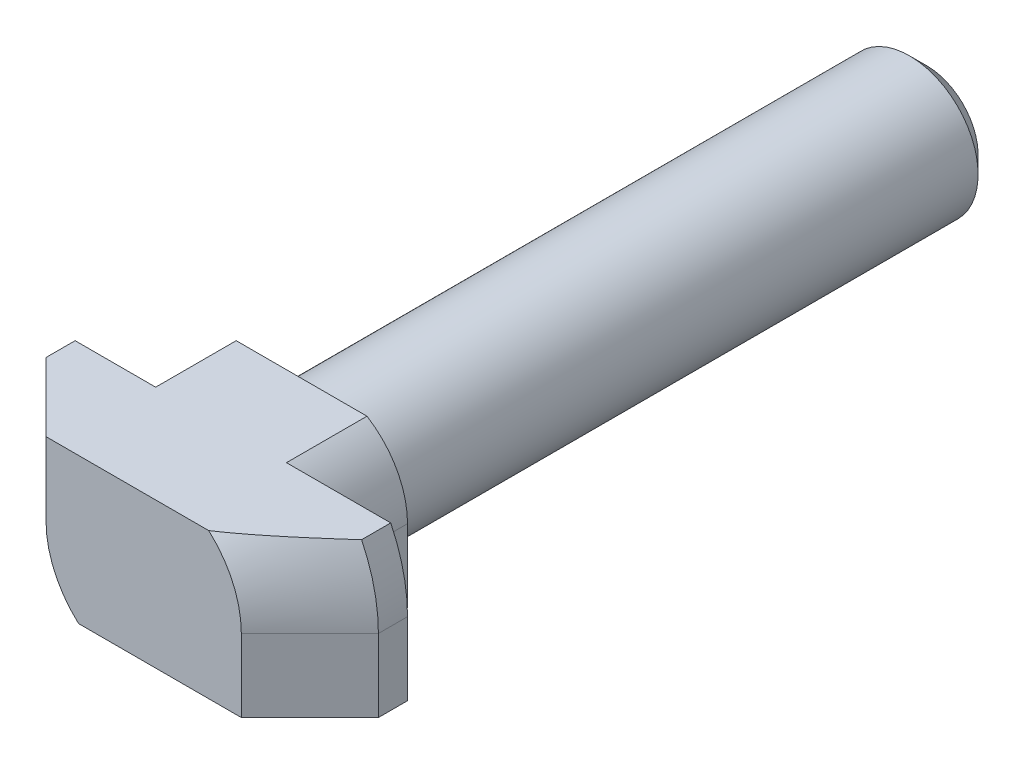
ISO-10303-21;
HEADER;
FILE_DESCRIPTION(('STEP AP214'),'2;1');
FILE_NAME('part.step','',(''),(''),'','','');
FILE_SCHEMA(('AUTOMOTIVE_DESIGN { 1 0 10303 214 1 1 1 1 }'));
ENDSEC;
DATA;
#1=APPLICATION_CONTEXT('core data for automotive mechanical design processes');
#2=APPLICATION_PROTOCOL_DEFINITION('international standard','automotive_design',2000,#1);
#3=PRODUCT_CONTEXT('',#1,'mechanical');
#4=PRODUCT('Part','Part','',(#3));
#5=PRODUCT_RELATED_PRODUCT_CATEGORY('part','',(#4));
#6=PRODUCT_DEFINITION_FORMATION('','',#4);
#7=PRODUCT_DEFINITION_CONTEXT('part definition',#1,'design');
#8=PRODUCT_DEFINITION('design','',#6,#7);
#9=PRODUCT_DEFINITION_SHAPE('','',#8);
#10=(LENGTH_UNIT() NAMED_UNIT(*) SI_UNIT(.MILLI.,.METRE.));
#11=(NAMED_UNIT(*) PLANE_ANGLE_UNIT() SI_UNIT($,.RADIAN.));
#12=(NAMED_UNIT(*) SI_UNIT($,.STERADIAN.) SOLID_ANGLE_UNIT());
#13=UNCERTAINTY_MEASURE_WITH_UNIT(LENGTH_MEASURE(1.E-05),#10,'distance_accuracy_value','');
#14=(GEOMETRIC_REPRESENTATION_CONTEXT(3) GLOBAL_UNCERTAINTY_ASSIGNED_CONTEXT((#13)) GLOBAL_UNIT_ASSIGNED_CONTEXT((#10,
#11,#12)) REPRESENTATION_CONTEXT('',''));
#15=CARTESIAN_POINT('',(0.,0.,0.));
#16=DIRECTION('',(0.,0.,1.));
#17=DIRECTION('',(1.,0.,0.));
#18=AXIS2_PLACEMENT_3D('',#15,#16,#17);
#19=CARTESIAN_POINT('',(-5.,-4.25,-3.5));
#20=DIRECTION('',(-1.,0.,0.));
#21=DIRECTION('',(0.,1.,0.));
#22=AXIS2_PLACEMENT_3D('',#19,#20,#21);
#23=PLANE('',#22);
#24=DIRECTION('',(0.,0.,1.));
#25=VECTOR('',#24,1.);
#26=CARTESIAN_POINT('',(-5.,4.25,-4.7));
#27=LINE('',#26,#25);
#28=CARTESIAN_POINT('',(-5.,4.25,-4.7));
#29=VERTEX_POINT('',#28);
#30=CARTESIAN_POINT('',(-5.,4.25,0.));
#31=VERTEX_POINT('',#30);
#32=EDGE_CURVE('E315',#29,#31,#27,.T.);
#33=ORIENTED_EDGE('',*,*,#32,.F.);
#34=DIRECTION('',(0.,1.,0.));
#35=VECTOR('',#34,1.);
#36=CARTESIAN_POINT('',(-5.,0.,-4.7));
#37=LINE('',#36,#35);
#38=CARTESIAN_POINT('',(-5.,0.,-4.7));
#39=VERTEX_POINT('',#38);
#40=EDGE_CURVE('E166',#39,#29,#37,.T.);
#41=ORIENTED_EDGE('',*,*,#40,.F.);
#42=DIRECTION('',(0.,0.,-1.));
#43=VECTOR('',#42,1.);
#44=CARTESIAN_POINT('',(-5.,0.,0.));
#45=LINE('',#44,#43);
#46=CARTESIAN_POINT('',(-5.,0.,0.));
#47=VERTEX_POINT('',#46);
#48=EDGE_CURVE('E99',#47,#39,#45,.T.);
#49=ORIENTED_EDGE('',*,*,#48,.F.);
#50=DIRECTION('',(0.,-1.,0.));
#51=VECTOR('',#50,1.);
#52=CARTESIAN_POINT('',(-5.,4.25,0.));
#53=LINE('',#52,#51);
#54=EDGE_CURVE('E183',#31,#47,#53,.T.);
#55=ORIENTED_EDGE('',*,*,#54,.F.);
#56=EDGE_LOOP('',(#33,#41,#49,#55));
#57=FACE_BOUND('',#56,.T.);
#58=ADVANCED_FACE('F16',(#57),#23,.T.);
#59=CARTESIAN_POINT('',(-9.7,-4.25,0.));
#60=DIRECTION('',(-1.,0.,0.));
#61=DIRECTION('',(0.,1.,0.));
#62=AXIS2_PLACEMENT_3D('',#59,#60,#61);
#63=PLANE('',#62);
#64=DIRECTION('',(0.,0.,1.));
#65=VECTOR('',#64,1.);
#66=CARTESIAN_POINT('',(-9.7,4.25,0.));
#67=LINE('',#66,#65);
#68=CARTESIAN_POINT('',(-9.7,4.25,0.));
#69=VERTEX_POINT('',#68);
#70=CARTESIAN_POINT('',(-9.7,4.25,1.7));
#71=VERTEX_POINT('',#70);
#72=EDGE_CURVE('E312',#69,#71,#67,.T.);
#73=ORIENTED_EDGE('',*,*,#72,.F.);
#74=DIRECTION('',(0.,1.,0.));
#75=VECTOR('',#74,1.);
#76=CARTESIAN_POINT('',(-9.7,0.,0.));
#77=LINE('',#76,#75);
#78=CARTESIAN_POINT('',(-9.7,-1.3280931909776E-13,0.));
#79=VERTEX_POINT('',#78);
#80=EDGE_CURVE('E184',#79,#69,#77,.T.);
#81=ORIENTED_EDGE('',*,*,#80,.F.);
#82=DIRECTION('',(0.,0.,-1.));
#83=VECTOR('',#82,1.);
#84=CARTESIAN_POINT('',(-9.7,0.,1.7));
#85=LINE('',#84,#83);
#86=CARTESIAN_POINT('',(-9.7,0.,1.7));
#87=VERTEX_POINT('',#86);
#88=EDGE_CURVE('E343',#87,#79,#85,.T.);
#89=ORIENTED_EDGE('',*,*,#88,.F.);
#90=DIRECTION('',(0.,-1.,0.));
#91=VECTOR('',#90,1.);
#92=CARTESIAN_POINT('',(-9.7,4.25,1.7));
#93=LINE('',#92,#91);
#94=EDGE_CURVE('E11',#71,#87,#93,.T.);
#95=ORIENTED_EDGE('',*,*,#94,.F.);
#96=EDGE_LOOP('',(#73,#81,#89,#95));
#97=FACE_BOUND('',#96,.T.);
#98=ADVANCED_FACE('F264',(#97),#63,.T.);
#99=CARTESIAN_POINT('',(-9.7,-4.25,1.7));
#100=DIRECTION('',(-0.707106781186547,0.,0.707106781186548));
#101=DIRECTION('',(0.,1.,0.));
#102=AXIS2_PLACEMENT_3D('',#99,#100,#101);
#103=PLANE('',#102);
#104=DIRECTION('',(0.707106781186548,0.,0.707106781186547));
#105=VECTOR('',#104,1.);
#106=CARTESIAN_POINT('',(-9.7,4.25,1.7));
#107=LINE('',#106,#105);
#108=CARTESIAN_POINT('',(-5.7,4.25,5.7));
#109=VERTEX_POINT('',#108);
#110=EDGE_CURVE('E314',#71,#109,#107,.T.);
#111=ORIENTED_EDGE('',*,*,#110,.F.);
#112=ORIENTED_EDGE('',*,*,#94,.T.);
#113=DIRECTION('',(-0.707106781186548,0.,-0.707106781186547));
#114=VECTOR('',#113,1.);
#115=CARTESIAN_POINT('',(-5.7,0.,5.7));
#116=LINE('',#115,#114);
#117=CARTESIAN_POINT('',(-5.7,-1.19015908239817E-13,5.7));
#118=VERTEX_POINT('',#117);
#119=EDGE_CURVE('E175',#118,#87,#116,.T.);
#120=ORIENTED_EDGE('',*,*,#119,.F.);
#121=DIRECTION('',(0.,-1.,0.));
#122=VECTOR('',#121,1.);
#123=CARTESIAN_POINT('',(-5.7,4.25,5.7));
#124=LINE('',#123,#122);
#125=EDGE_CURVE('E390',#109,#118,#124,.T.);
#126=ORIENTED_EDGE('',*,*,#125,.F.);
#127=EDGE_LOOP('',(#111,#112,#120,#126));
#128=FACE_BOUND('',#127,.T.);
#129=ADVANCED_FACE('F263',(#128),#103,.T.);
#130=CARTESIAN_POINT('',(0.,-4.25,0.));
#131=DIRECTION('',(0.,1.,0.));
#132=DIRECTION('',(1.,0.,0.));
#133=AXIS2_PLACEMENT_3D('',#130,#131,#132);
#134=PLANE('',#133);
#135=DIRECTION('',(1.,0.,0.));
#136=VECTOR('',#135,1.);
#137=CARTESIAN_POINT('',(-8.71937497760017,-4.25,0.));
#138=LINE('',#137,#136);
#139=CARTESIAN_POINT('',(-8.71937497760017,-4.25,0.));
#140=VERTEX_POINT('',#139);
#141=CARTESIAN_POINT('',(-2.63391343821319,-4.25,0.));
#142=VERTEX_POINT('',#141);
#143=EDGE_CURVE('E348',#140,#142,#138,.T.);
#144=ORIENTED_EDGE('',*,*,#143,.T.);
#145=DIRECTION('',(0.,0.,1.));
#146=VECTOR('',#145,1.);
#147=CARTESIAN_POINT('',(-2.63391343821319,-4.25,-4.7));
#148=LINE('',#147,#146);
#149=CARTESIAN_POINT('',(-2.63391343821319,-4.25,-4.7));
#150=VERTEX_POINT('',#149);
#151=EDGE_CURVE('E168',#150,#142,#148,.T.);
#152=ORIENTED_EDGE('',*,*,#151,.F.);
#153=DIRECTION('',(-1.,0.,0.));
#154=VECTOR('',#153,1.);
#155=CARTESIAN_POINT('',(5.,-4.25,-4.7));
#156=LINE('',#155,#154);
#157=CARTESIAN_POINT('',(5.,-4.25,-4.7));
#158=VERTEX_POINT('',#157);
#159=EDGE_CURVE('E323',#158,#150,#156,.T.);
#160=ORIENTED_EDGE('',*,*,#159,.F.);
#161=DIRECTION('',(0.,0.,1.));
#162=VECTOR('',#161,1.);
#163=CARTESIAN_POINT('',(5.,-4.25,-4.7));
#164=LINE('',#163,#162);
#165=CARTESIAN_POINT('',(5.,-4.25,0.));
#166=VERTEX_POINT('',#165);
#167=EDGE_CURVE('E162',#158,#166,#164,.T.);
#168=ORIENTED_EDGE('',*,*,#167,.T.);
#169=DIRECTION('',(1.,0.,0.));
#170=VECTOR('',#169,1.);
#171=CARTESIAN_POINT('',(5.,-4.25,0.));
#172=LINE('',#171,#170);
#173=CARTESIAN_POINT('',(9.7,-4.25,0.));
#174=VERTEX_POINT('',#173);
#175=EDGE_CURVE('E156',#166,#174,#172,.T.);
#176=ORIENTED_EDGE('',*,*,#175,.T.);
#177=DIRECTION('',(0.,0.,1.));
#178=VECTOR('',#177,1.);
#179=CARTESIAN_POINT('',(9.7,-4.25,0.));
#180=LINE('',#179,#178);
#181=CARTESIAN_POINT('',(9.7,-4.25,1.7));
#182=VERTEX_POINT('',#181);
#183=EDGE_CURVE('E27',#174,#182,#180,.T.);
#184=ORIENTED_EDGE('',*,*,#183,.T.);
#185=DIRECTION('',(-0.707106781186547,0.,0.707106781186548));
#186=VECTOR('',#185,1.);
#187=CARTESIAN_POINT('',(9.7,-4.25,1.7));
#188=LINE('',#187,#186);
#189=CARTESIAN_POINT('',(5.7,-4.25,5.7));
#190=VERTEX_POINT('',#189);
#191=EDGE_CURVE('E335',#182,#190,#188,.T.);
#192=ORIENTED_EDGE('',*,*,#191,.T.);
#193=DIRECTION('',(-1.,0.,0.));
#194=VECTOR('',#193,1.);
#195=CARTESIAN_POINT('',(5.7,-4.25,5.7));
#196=LINE('',#195,#194);
#197=CARTESIAN_POINT('',(-3.79835490706175,-4.25,5.7));
#198=VERTEX_POINT('',#197);
#199=EDGE_CURVE('E368',#190,#198,#196,.T.);
#200=ORIENTED_EDGE('',*,*,#199,.T.);
#201=CARTESIAN_POINT('',(-8.71937497760019,-4.24999999999997,1.70000000000001));
#202=CARTESIAN_POINT('',(-8.57450270494282,-4.25000319465092,1.83021943252909));
#203=CARTESIAN_POINT('',(-8.42931728141366,-4.25004385302308,1.96009161295506));
#204=CARTESIAN_POINT('',(-8.1437825474531,-4.25014152903638,2.21409873690859));
#205=CARTESIAN_POINT('',(-8.00345988492291,-4.25019786389707,2.33826364440192));
#206=CARTESIAN_POINT('',(-7.72764747755327,-4.25027542681914,2.58085892885828));
#207=CARTESIAN_POINT('',(-7.59218629004772,-4.2502979562429,2.69932175295181));
#208=CARTESIAN_POINT('',(-7.32608002049505,-4.25029385836591,2.93050866643692));
#209=CARTESIAN_POINT('',(-7.19546594552676,-4.25026921429713,3.04326842909159));
#210=CARTESIAN_POINT('',(-6.93902863210305,-4.25018370852051,3.26304706374375));
#211=CARTESIAN_POINT('',(-6.81323919190168,-4.25012443956091,3.37010534376589));
#212=CARTESIAN_POINT('',(-6.5664104194106,-4.25002340655793,3.57847427538683));
#213=CARTESIAN_POINT('',(-6.4454083031052,-4.24998098186133,3.67982898664687));
#214=CARTESIAN_POINT('',(-6.18165550366021,-4.24995904779762,3.89875238754623));
#215=CARTESIAN_POINT('',(-6.03873633980194,-4.24999158583165,4.01611840018248));
#216=CARTESIAN_POINT('',(-5.75820107982702,-4.25003674648944,4.24365468483897));
#217=CARTESIAN_POINT('',(-5.62064973052614,-4.25005022968583,4.3539047032508));
#218=CARTESIAN_POINT('',(-5.35078258937413,-4.25002434400976,4.56720562462831));
#219=CARTESIAN_POINT('',(-5.21853751991184,-4.24998751367225,4.67034587747562));
#220=CARTESIAN_POINT('',(-4.93792226345441,-4.24995810734381,4.88568698798326));
#221=CARTESIAN_POINT('',(-4.78936759257905,-4.24997080067208,4.99764798234654));
#222=CARTESIAN_POINT('',(-4.49781207699236,-4.24999785078291,5.21262804183896));
#223=CARTESIAN_POINT('',(-4.3549301124361,-4.25001208494948,5.31580768428956));
#224=CARTESIAN_POINT('',(-4.07448766867418,-4.25002240543764,5.51315957745188));
#225=CARTESIAN_POINT('',(-3.93705740064285,-4.25001943175796,5.60751715888763));
#226=CARTESIAN_POINT('',(-3.79835490706176,-4.24999999999998,5.70000000000001));
#227=B_SPLINE_CURVE_WITH_KNOTS('',3,(#201,#202,#203,#204,#205,#206,#207,#208,#209,#210,#211,
#212,#213,#214,#215,#216,#217,#218,#219,#220,#221,#222,#223,#224,#225,#226),.UNSPECIFIED.,.F.,
.F.,(4,2,2,2,2,2,2,2,2,2,2,2,4),(0.,0.584385416812869,1.14649156786177,1.68634794115197,
2.20400540412395,2.69954103939917,3.17306374359512,3.7278543681573,4.25668744993707,
4.75980107100538,5.31783118760138,5.84650912556475,6.3465900112296),.UNSPECIFIED.);
#228=CARTESIAN_POINT('',(-8.71937497760018,-4.25,1.7));
#229=VERTEX_POINT('',#228);
#230=EDGE_CURVE('E178',#229,#198,#227,.T.);
#231=ORIENTED_EDGE('',*,*,#230,.F.);
#232=DIRECTION('',(0.,0.,1.));
#233=VECTOR('',#232,1.);
#234=CARTESIAN_POINT('',(-8.71937497760017,-4.25,0.));
#235=LINE('',#234,#233);
#236=EDGE_CURVE('E345',#140,#229,#235,.T.);
#237=ORIENTED_EDGE('',*,*,#236,.F.);
#238=EDGE_LOOP('',(#144,#152,#160,#168,#176,#184,#192,#200,#231,#237));
#239=FACE_BOUND('',#238,.T.);
#240=ADVANCED_FACE('F254',(#239),#134,.F.);
#241=CARTESIAN_POINT('',(9.7,-4.25,1.7));
#242=DIRECTION('',(1.,0.,0.));
#243=DIRECTION('',(0.,-1.,0.));
#244=AXIS2_PLACEMENT_3D('',#241,#242,#243);
#245=PLANE('',#244);
#246=ORIENTED_EDGE('',*,*,#183,.F.);
#247=DIRECTION('',(0.,-1.,0.));
#248=VECTOR('',#247,1.);
#249=CARTESIAN_POINT('',(9.7,0.,0.));
#250=LINE('',#249,#248);
#251=CARTESIAN_POINT('',(9.7,1.4741097231763E-13,0.));
#252=VERTEX_POINT('',#251);
#253=EDGE_CURVE('E152',#252,#174,#250,.T.);
#254=ORIENTED_EDGE('',*,*,#253,.F.);
#255=DIRECTION('',(0.,0.,-1.));
#256=VECTOR('',#255,1.);
#257=CARTESIAN_POINT('',(9.7,0.,1.7));
#258=LINE('',#257,#256);
#259=CARTESIAN_POINT('',(9.7,0.,1.7));
#260=VERTEX_POINT('',#259);
#261=EDGE_CURVE('E144',#260,#252,#258,.T.);
#262=ORIENTED_EDGE('',*,*,#261,.F.);
#263=DIRECTION('',(0.,-1.,0.));
#264=VECTOR('',#263,1.);
#265=CARTESIAN_POINT('',(9.7,0.,1.7));
#266=LINE('',#265,#264);
#267=EDGE_CURVE('E186',#260,#182,#266,.T.);
#268=ORIENTED_EDGE('',*,*,#267,.T.);
#269=EDGE_LOOP('',(#246,#254,#262,#268));
#270=FACE_BOUND('',#269,.T.);
#271=ADVANCED_FACE('F158',(#270),#245,.T.);
#272=CARTESIAN_POINT('',(5.7,-4.25,5.7));
#273=DIRECTION('',(0.707106781186547,0.,0.707106781186548));
#274=DIRECTION('',(0.,-1.,0.));
#275=AXIS2_PLACEMENT_3D('',#272,#273,#274);
#276=PLANE('',#275);
#277=ORIENTED_EDGE('',*,*,#191,.F.);
#278=ORIENTED_EDGE('',*,*,#267,.F.);
#279=DIRECTION('',(0.707106781186548,0.,-0.707106781186548));
#280=VECTOR('',#279,1.);
#281=CARTESIAN_POINT('',(5.7,0.,5.7));
#282=LINE('',#281,#280);
#283=CARTESIAN_POINT('',(5.7,0.,5.7));
#284=VERTEX_POINT('',#283);
#285=EDGE_CURVE('E333',#284,#260,#282,.T.);
#286=ORIENTED_EDGE('',*,*,#285,.F.);
#287=DIRECTION('',(0.,-1.,0.));
#288=VECTOR('',#287,1.);
#289=CARTESIAN_POINT('',(5.7,0.,5.7));
#290=LINE('',#289,#288);
#291=EDGE_CURVE('E365',#284,#190,#290,.T.);
#292=ORIENTED_EDGE('',*,*,#291,.T.);
#293=EDGE_LOOP('',(#277,#278,#286,#292));
#294=FACE_BOUND('',#293,.T.);
#295=ADVANCED_FACE('F208',(#294),#276,.T.);
#296=CARTESIAN_POINT('',(0.,0.,1.61514379200931));
#297=DIRECTION('',(0.,0.,-1.));
#298=DIRECTION('',(-1.,0.,0.));
#299=AXIS2_PLACEMENT_3D('',#296,#297,#298);
#300=CONICAL_SURFACE('',#299,9.78485620799071,0.785398163397449);
#301=ORIENTED_EDGE('',*,*,#285,.T.);
#302=CARTESIAN_POINT('',(0.,0.,1.7));
#303=DIRECTION('',(0.,0.,1.));
#304=DIRECTION('',(1.,0.,0.));
#305=AXIS2_PLACEMENT_3D('',#302,#303,#304);
#306=CIRCLE('',#305,9.7);
#307=CARTESIAN_POINT('',(8.71937497760018,4.25,1.7));
#308=VERTEX_POINT('',#307);
#309=EDGE_CURVE('E146',#260,#308,#306,.T.);
#310=ORIENTED_EDGE('',*,*,#309,.T.);
#311=CARTESIAN_POINT('',(8.71937497760018,4.25,1.70000000000001));
#312=CARTESIAN_POINT('',(8.57450270590519,4.25000319464969,1.8302194316653));
#313=CARTESIAN_POINT('',(8.42931728333833,4.25004385303689,1.96009161122724));
#314=CARTESIAN_POINT('',(8.14378255091275,4.25014152907125,2.21409873382326));
#315=CARTESIAN_POINT('',(8.00345988895308,4.25019786393834,2.33826364082069));
#316=CARTESIAN_POINT('',(7.7276474823439,4.2502754268288,2.58085892465498));
#317=CARTESIAN_POINT('',(7.59218629502572,4.25029795621623,2.69932174861942));
#318=CARTESIAN_POINT('',(7.32608002548065,4.25029385817896,2.93050866221821));
#319=CARTESIAN_POINT('',(7.19546595032938,4.25026921398976,3.04326842511196));
#320=CARTESIAN_POINT('',(6.93902863618314,4.25018370785951,3.26304706061028));
#321=CARTESIAN_POINT('',(6.81323919543849,4.25012443867162,3.37010534123512));
#322=CARTESIAN_POINT('',(6.56641042153457,4.25002340501019,3.57847427444632));
#323=CARTESIAN_POINT('',(6.44540830435448,4.24998097989287,3.67982898668777));
#324=CARTESIAN_POINT('',(6.18165550296406,4.24995904481563,3.89875238981102));
#325=CARTESIAN_POINT('',(6.0387363380387,4.24999158223973,4.01611840369485));
#326=CARTESIAN_POINT('',(5.75820107712938,4.25003674195346,4.24365468969755));
#327=CARTESIAN_POINT('',(5.62064972797649,4.25005022480429,4.35390470822659));
#328=CARTESIAN_POINT('',(5.35078258824899,4.25002433888383,4.56720562868675));
#329=CARTESIAN_POINT('',(5.21853752008206,4.24998750862705,4.67034588052317));
#330=CARTESIAN_POINT('',(4.93792226671938,4.24995810300803,4.8856869883217));
#331=CARTESIAN_POINT('',(4.78936759763459,4.24997079702366,4.99764798097488));
#332=CARTESIAN_POINT('',(4.49781208363821,4.24999784856009,5.21262803854228));
#333=CARTESIAN_POINT('',(4.35493011885312,4.25001208346037,5.31580768074017));
#334=CARTESIAN_POINT('',(4.07448767280019,4.25002240503515,5.51315957491955));
#335=CARTESIAN_POINT('',(3.93705740266949,4.25001943172661,5.60751715757258));
#336=CARTESIAN_POINT('',(3.79835490706175,4.25,5.70000000000001));
#337=B_SPLINE_CURVE_WITH_KNOTS('',3,(#311,#312,#313,#314,#315,#316,#317,#318,#319,#320,#321,
#322,#323,#324,#325,#326,#327,#328,#329,#330,#331,#332,#333,#334,#335,#336),.UNSPECIFIED.,.F.,
.F.,(4,2,2,2,2,2,2,2,2,2,2,2,4),(0.,0.584385412933182,1.14649156171448,1.68634793432677,
2.20400539818323,2.69954103587226,3.17306374397149,3.72785437338236,4.25668745503392,
4.75980107116974,5.31783118038389,5.84650911846317,6.34659001138537),.UNSPECIFIED.);
#338=CARTESIAN_POINT('',(3.79835490706175,4.25,5.7));
#339=VERTEX_POINT('',#338);
#340=EDGE_CURVE('E191',#308,#339,#337,.T.);
#341=ORIENTED_EDGE('',*,*,#340,.T.);
#342=CARTESIAN_POINT('',(0.,0.,5.7));
#343=DIRECTION('',(0.,0.,1.));
#344=DIRECTION('',(1.,0.,0.));
#345=AXIS2_PLACEMENT_3D('',#342,#343,#344);
#346=CIRCLE('',#345,5.7);
#347=EDGE_CURVE('E367',#284,#339,#346,.T.);
#348=ORIENTED_EDGE('',*,*,#347,.F.);
#349=EDGE_LOOP('',(#301,#310,#341,#348));
#350=FACE_BOUND('',#349,.T.);
#351=ADVANCED_FACE('F198',(#350),#300,.T.);
#352=CARTESIAN_POINT('',(0.,0.,-3.96));
#353=DIRECTION('',(0.,0.,-1.));
#354=DIRECTION('',(-1.,0.,0.));
#355=AXIS2_PLACEMENT_3D('',#352,#353,#354);
#356=CYLINDRICAL_SURFACE('',#355,9.7);
#357=ORIENTED_EDGE('',*,*,#261,.T.);
#358=CARTESIAN_POINT('',(0.,0.,0.));
#359=DIRECTION('',(0.,0.,-1.));
#360=DIRECTION('',(0.898904636865997,0.438144329896907,0.));
#361=AXIS2_PLACEMENT_3D('',#358,#359,#360);
#362=CIRCLE('',#361,9.7);
#363=CARTESIAN_POINT('',(8.71937497760018,4.25,0.));
#364=VERTEX_POINT('',#363);
#365=EDGE_CURVE('E62',#364,#252,#362,.T.);
#366=ORIENTED_EDGE('',*,*,#365,.F.);
#367=DIRECTION('',(0.,0.,1.));
#368=VECTOR('',#367,1.);
#369=CARTESIAN_POINT('',(8.71937497760018,4.25,0.));
#370=LINE('',#369,#368);
#371=EDGE_CURVE('E332',#364,#308,#370,.T.);
#372=ORIENTED_EDGE('',*,*,#371,.T.);
#373=ORIENTED_EDGE('',*,*,#309,.F.);
#374=EDGE_LOOP('',(#357,#366,#372,#373));
#375=FACE_BOUND('',#374,.T.);
#376=ADVANCED_FACE('F145',(#375),#356,.T.);
#377=CARTESIAN_POINT('',(9.7,-4.25,0.));
#378=DIRECTION('',(0.,0.,-1.));
#379=DIRECTION('',(0.,1.,0.));
#380=AXIS2_PLACEMENT_3D('',#377,#378,#379);
#381=PLANE('',#380);
#382=ORIENTED_EDGE('',*,*,#253,.T.);
#383=ORIENTED_EDGE('',*,*,#175,.F.);
#384=DIRECTION('',(0.,1.,0.));
#385=VECTOR('',#384,1.);
#386=CARTESIAN_POINT('',(5.,-4.25,0.));
#387=LINE('',#386,#385);
#388=CARTESIAN_POINT('',(5.,0.,0.));
#389=VERTEX_POINT('',#388);
#390=EDGE_CURVE('E159',#166,#389,#387,.T.);
#391=ORIENTED_EDGE('',*,*,#390,.T.);
#392=CARTESIAN_POINT('',(0.,0.,0.));
#393=DIRECTION('',(0.,0.,1.));
#394=DIRECTION('',(1.,0.,0.));
#395=AXIS2_PLACEMENT_3D('',#392,#393,#394);
#396=CIRCLE('',#395,5.);
#397=CARTESIAN_POINT('',(2.63391343821319,4.25,0.));
#398=VERTEX_POINT('',#397);
#399=EDGE_CURVE('E51',#389,#398,#396,.T.);
#400=ORIENTED_EDGE('',*,*,#399,.T.);
#401=DIRECTION('',(-1.,0.,0.));
#402=VECTOR('',#401,1.);
#403=CARTESIAN_POINT('',(8.71937497760018,4.25,0.));
#404=LINE('',#403,#402);
#405=EDGE_CURVE('E154',#364,#398,#404,.T.);
#406=ORIENTED_EDGE('',*,*,#405,.F.);
#407=ORIENTED_EDGE('',*,*,#365,.T.);
#408=EDGE_LOOP('',(#382,#383,#391,#400,#406,#407));
#409=FACE_BOUND('',#408,.T.);
#410=ADVANCED_FACE('F151',(#409),#381,.T.);
#411=CARTESIAN_POINT('',(5.,-4.25,0.));
#412=DIRECTION('',(1.,0.,0.));
#413=DIRECTION('',(0.,-1.,0.));
#414=AXIS2_PLACEMENT_3D('',#411,#412,#413);
#415=PLANE('',#414);
#416=ORIENTED_EDGE('',*,*,#167,.F.);
#417=DIRECTION('',(0.,-1.,0.));
#418=VECTOR('',#417,1.);
#419=CARTESIAN_POINT('',(5.,0.,-4.7));
#420=LINE('',#419,#418);
#421=CARTESIAN_POINT('',(5.,0.,-4.7));
#422=VERTEX_POINT('',#421);
#423=EDGE_CURVE('E320',#422,#158,#420,.T.);
#424=ORIENTED_EDGE('',*,*,#423,.F.);
#425=DIRECTION('',(0.,0.,-1.));
#426=VECTOR('',#425,1.);
#427=CARTESIAN_POINT('',(5.,0.,0.));
#428=LINE('',#427,#426);
#429=EDGE_CURVE('E174',#389,#422,#428,.T.);
#430=ORIENTED_EDGE('',*,*,#429,.F.);
#431=ORIENTED_EDGE('',*,*,#390,.F.);
#432=EDGE_LOOP('',(#416,#424,#430,#431));
#433=FACE_BOUND('',#432,.T.);
#434=ADVANCED_FACE('F225',(#433),#415,.T.);
#435=CARTESIAN_POINT('',(0.,0.,-3.96));
#436=DIRECTION('',(0.,0.,-1.));
#437=DIRECTION('',(-1.,0.,0.));
#438=AXIS2_PLACEMENT_3D('',#435,#436,#437);
#439=CYLINDRICAL_SURFACE('',#438,5.);
#440=ORIENTED_EDGE('',*,*,#399,.F.);
#441=ORIENTED_EDGE('',*,*,#429,.T.);
#442=CARTESIAN_POINT('',(0.,0.,-4.7));
#443=DIRECTION('',(0.,0.,-1.));
#444=DIRECTION('',(0.526782687642637,0.85,0.));
#445=AXIS2_PLACEMENT_3D('',#442,#443,#444);
#446=CIRCLE('',#445,5.);
#447=CARTESIAN_POINT('',(2.63391343821319,4.25,-4.7));
#448=VERTEX_POINT('',#447);
#449=EDGE_CURVE('E324',#448,#422,#446,.T.);
#450=ORIENTED_EDGE('',*,*,#449,.F.);
#451=DIRECTION('',(0.,0.,1.));
#452=VECTOR('',#451,1.);
#453=CARTESIAN_POINT('',(2.63391343821319,4.25,-4.7));
#454=LINE('',#453,#452);
#455=EDGE_CURVE('E331',#448,#398,#454,.T.);
#456=ORIENTED_EDGE('',*,*,#455,.T.);
#457=EDGE_LOOP('',(#440,#441,#450,#456));
#458=FACE_BOUND('',#457,.T.);
#459=ADVANCED_FACE('F222',(#458),#439,.T.);
#460=CARTESIAN_POINT('',(0.,4.25,0.));
#461=DIRECTION('',(0.,1.,0.));
#462=DIRECTION('',(1.,0.,0.));
#463=AXIS2_PLACEMENT_3D('',#460,#461,#462);
#464=PLANE('',#463);
#465=DIRECTION('',(1.,0.,0.));
#466=VECTOR('',#465,1.);
#467=CARTESIAN_POINT('',(-5.,4.25,-4.7));
#468=LINE('',#467,#466);
#469=EDGE_CURVE('E337',#29,#448,#468,.T.);
#470=ORIENTED_EDGE('',*,*,#469,.F.);
#471=ORIENTED_EDGE('',*,*,#32,.T.);
#472=DIRECTION('',(1.,0.,0.));
#473=VECTOR('',#472,1.);
#474=CARTESIAN_POINT('',(-9.7,4.25,0.));
#475=LINE('',#474,#473);
#476=EDGE_CURVE('E180',#69,#31,#475,.T.);
#477=ORIENTED_EDGE('',*,*,#476,.F.);
#478=ORIENTED_EDGE('',*,*,#72,.T.);
#479=ORIENTED_EDGE('',*,*,#110,.T.);
#480=DIRECTION('',(1.,0.,0.));
#481=VECTOR('',#480,1.);
#482=CARTESIAN_POINT('',(-5.7,4.25,5.7));
#483=LINE('',#482,#481);
#484=EDGE_CURVE('E328',#109,#339,#483,.T.);
#485=ORIENTED_EDGE('',*,*,#484,.T.);
#486=ORIENTED_EDGE('',*,*,#340,.F.);
#487=ORIENTED_EDGE('',*,*,#371,.F.);
#488=ORIENTED_EDGE('',*,*,#405,.T.);
#489=ORIENTED_EDGE('',*,*,#455,.F.);
#490=EDGE_LOOP('',(#470,#471,#477,#478,#479,#485,#486,#487,#488,#489));
#491=FACE_BOUND('',#490,.T.);
#492=ADVANCED_FACE('F18',(#491),#464,.T.);
#493=CARTESIAN_POINT('',(-5.7,-4.25,5.7));
#494=DIRECTION('',(0.,0.,1.));
#495=DIRECTION('',(0.,-1.,0.));
#496=AXIS2_PLACEMENT_3D('',#493,#494,#495);
#497=PLANE('',#496);
#498=ORIENTED_EDGE('',*,*,#125,.T.);
#499=CARTESIAN_POINT('',(0.,0.,5.7));
#500=DIRECTION('',(0.,0.,1.));
#501=DIRECTION('',(-1.,0.,0.));
#502=AXIS2_PLACEMENT_3D('',#499,#500,#501);
#503=CIRCLE('',#502,5.7);
#504=EDGE_CURVE('E393',#118,#198,#503,.T.);
#505=ORIENTED_EDGE('',*,*,#504,.T.);
#506=ORIENTED_EDGE('',*,*,#199,.F.);
#507=ORIENTED_EDGE('',*,*,#291,.F.);
#508=ORIENTED_EDGE('',*,*,#347,.T.);
#509=ORIENTED_EDGE('',*,*,#484,.F.);
#510=EDGE_LOOP('',(#498,#505,#506,#507,#508,#509));
#511=FACE_BOUND('',#510,.T.);
#512=ADVANCED_FACE('F233',(#511),#497,.T.);
#513=CARTESIAN_POINT('',(0.,0.,1.6151437920093));
#514=DIRECTION('',(0.,0.,-1.));
#515=DIRECTION('',(-1.,0.,0.));
#516=AXIS2_PLACEMENT_3D('',#513,#514,#515);
#517=CONICAL_SURFACE('',#516,9.78485620799071,0.785398163397449);
#518=ORIENTED_EDGE('',*,*,#119,.T.);
#519=CARTESIAN_POINT('',(0.,0.,1.7));
#520=DIRECTION('',(0.,0.,1.));
#521=DIRECTION('',(-1.,0.,0.));
#522=AXIS2_PLACEMENT_3D('',#519,#520,#521);
#523=CIRCLE('',#522,9.7);
#524=EDGE_CURVE('E179',#87,#229,#523,.T.);
#525=ORIENTED_EDGE('',*,*,#524,.T.);
#526=ORIENTED_EDGE('',*,*,#230,.T.);
#527=ORIENTED_EDGE('',*,*,#504,.F.);
#528=EDGE_LOOP('',(#518,#525,#526,#527));
#529=FACE_BOUND('',#528,.T.);
#530=ADVANCED_FACE('F220',(#529),#517,.T.);
#531=CARTESIAN_POINT('',(0.,0.,-3.96));
#532=DIRECTION('',(0.,0.,-1.));
#533=DIRECTION('',(-1.,0.,0.));
#534=AXIS2_PLACEMENT_3D('',#531,#532,#533);
#535=CYLINDRICAL_SURFACE('',#534,9.7);
#536=ORIENTED_EDGE('',*,*,#88,.T.);
#537=CARTESIAN_POINT('',(0.,0.,0.));
#538=DIRECTION('',(0.,0.,-1.));
#539=DIRECTION('',(-0.898904636865997,-0.438144329896907,0.));
#540=AXIS2_PLACEMENT_3D('',#537,#538,#539);
#541=CIRCLE('',#540,9.7);
#542=EDGE_CURVE('E304',#140,#79,#541,.T.);
#543=ORIENTED_EDGE('',*,*,#542,.F.);
#544=ORIENTED_EDGE('',*,*,#236,.T.);
#545=ORIENTED_EDGE('',*,*,#524,.F.);
#546=EDGE_LOOP('',(#536,#543,#544,#545));
#547=FACE_BOUND('',#546,.T.);
#548=ADVANCED_FACE('F216',(#547),#535,.T.);
#549=CARTESIAN_POINT('',(-5.,-4.25,0.));
#550=DIRECTION('',(0.,0.,-1.));
#551=DIRECTION('',(0.,1.,0.));
#552=AXIS2_PLACEMENT_3D('',#549,#550,#551);
#553=PLANE('',#552);
#554=ORIENTED_EDGE('',*,*,#80,.T.);
#555=ORIENTED_EDGE('',*,*,#476,.T.);
#556=ORIENTED_EDGE('',*,*,#54,.T.);
#557=CARTESIAN_POINT('',(0.,0.,0.));
#558=DIRECTION('',(0.,0.,1.));
#559=DIRECTION('',(-1.,0.,0.));
#560=AXIS2_PLACEMENT_3D('',#557,#558,#559);
#561=CIRCLE('',#560,5.);
#562=EDGE_CURVE('E171',#47,#142,#561,.T.);
#563=ORIENTED_EDGE('',*,*,#562,.T.);
#564=ORIENTED_EDGE('',*,*,#143,.F.);
#565=ORIENTED_EDGE('',*,*,#542,.T.);
#566=EDGE_LOOP('',(#554,#555,#556,#563,#564,#565));
#567=FACE_BOUND('',#566,.T.);
#568=ADVANCED_FACE('F219',(#567),#553,.T.);
#569=CARTESIAN_POINT('',(0.,0.,-3.96));
#570=DIRECTION('',(0.,0.,-1.));
#571=DIRECTION('',(-1.,0.,0.));
#572=AXIS2_PLACEMENT_3D('',#569,#570,#571);
#573=CYLINDRICAL_SURFACE('',#572,5.);
#574=ORIENTED_EDGE('',*,*,#48,.T.);
#575=CARTESIAN_POINT('',(0.,0.,-4.7));
#576=DIRECTION('',(0.,0.,-1.));
#577=DIRECTION('',(-0.526782687642638,-0.85,0.));
#578=AXIS2_PLACEMENT_3D('',#575,#576,#577);
#579=CIRCLE('',#578,5.);
#580=EDGE_CURVE('E317',#150,#39,#579,.T.);
#581=ORIENTED_EDGE('',*,*,#580,.F.);
#582=ORIENTED_EDGE('',*,*,#151,.T.);
#583=ORIENTED_EDGE('',*,*,#562,.F.);
#584=EDGE_LOOP('',(#574,#581,#582,#583));
#585=FACE_BOUND('',#584,.T.);
#586=ADVANCED_FACE('F209',(#585),#573,.T.);
#587=CARTESIAN_POINT('',(-4.25,-4.25,-4.7));
#588=DIRECTION('',(0.,0.,-1.));
#589=DIRECTION('',(0.,1.,0.));
#590=AXIS2_PLACEMENT_3D('',#587,#588,#589);
#591=PLANE('',#590);
#592=CARTESIAN_POINT('',(0.,0.,-4.7));
#593=DIRECTION('',(0.,0.,1.));
#594=DIRECTION('',(-1.,0.,0.));
#595=AXIS2_PLACEMENT_3D('',#592,#593,#594);
#596=CIRCLE('',#595,4.);
#597=CARTESIAN_POINT('',(-4.,0.,-4.7));
#598=VERTEX_POINT('',#597);
#599=EDGE_CURVE('E107',#598,#598,#596,.T.);
#600=ORIENTED_EDGE('',*,*,#599,.T.);
#601=EDGE_LOOP('',(#600));
#602=FACE_BOUND('',#601,.T.);
#603=ORIENTED_EDGE('',*,*,#40,.T.);
#604=ORIENTED_EDGE('',*,*,#469,.T.);
#605=ORIENTED_EDGE('',*,*,#449,.T.);
#606=ORIENTED_EDGE('',*,*,#423,.T.);
#607=ORIENTED_EDGE('',*,*,#159,.T.);
#608=ORIENTED_EDGE('',*,*,#580,.T.);
#609=EDGE_LOOP('',(#603,#604,#605,#606,#607,#608));
#610=FACE_BOUND('',#609,.T.);
#611=ADVANCED_FACE('F278',(#602,#610),#591,.T.);
#612=CARTESIAN_POINT('',(0.,0.,-3.5));
#613=DIRECTION('',(0.,0.,1.));
#614=DIRECTION('',(1.,0.,0.));
#615=AXIS2_PLACEMENT_3D('',#612,#613,#614);
#616=CYLINDRICAL_SURFACE('',#615,4.);
#617=CARTESIAN_POINT('',(0.,0.,-39.));
#618=DIRECTION('',(0.,0.,-1.));
#619=DIRECTION('',(1.,0.,0.));
#620=AXIS2_PLACEMENT_3D('',#617,#618,#619);
#621=CIRCLE('',#620,4.);
#622=CARTESIAN_POINT('',(-4.,0.,-39.));
#623=VERTEX_POINT('',#622);
#624=EDGE_CURVE('E325',#623,#623,#621,.T.);
#625=ORIENTED_EDGE('',*,*,#624,.F.);
#626=EDGE_LOOP('',(#625));
#627=FACE_BOUND('',#626,.T.);
#628=ORIENTED_EDGE('',*,*,#599,.F.);
#629=EDGE_LOOP('',(#628));
#630=FACE_BOUND('',#629,.T.);
#631=ADVANCED_FACE('F214',(#627,#630),#616,.T.);
#632=CARTESIAN_POINT('',(0.,0.,-38.9151437920093));
#633=DIRECTION('',(0.,0.,1.));
#634=DIRECTION('',(-1.,0.,0.));
#635=AXIS2_PLACEMENT_3D('',#632,#633,#634);
#636=CONICAL_SURFACE('',#635,4.0848562079907,0.785398163397448);
#637=CARTESIAN_POINT('',(0.,0.,-40.));
#638=DIRECTION('',(0.,0.,-1.));
#639=DIRECTION('',(1.,0.,0.));
#640=AXIS2_PLACEMENT_3D('',#637,#638,#639);
#641=CIRCLE('',#640,3.);
#642=CARTESIAN_POINT('',(-3.,0.,-40.));
#643=VERTEX_POINT('',#642);
#644=EDGE_CURVE('E341',#643,#643,#641,.T.);
#645=ORIENTED_EDGE('',*,*,#644,.F.);
#646=EDGE_LOOP('',(#645));
#647=FACE_BOUND('',#646,.T.);
#648=ORIENTED_EDGE('',*,*,#624,.T.);
#649=EDGE_LOOP('',(#648));
#650=FACE_BOUND('',#649,.T.);
#651=ADVANCED_FACE('F210',(#647,#650),#636,.T.);
#652=CARTESIAN_POINT('',(0.,0.,-40.));
#653=DIRECTION('',(0.,0.,1.));
#654=DIRECTION('',(1.,0.,0.));
#655=AXIS2_PLACEMENT_3D('',#652,#653,#654);
#656=PLANE('',#655);
#657=ORIENTED_EDGE('',*,*,#644,.T.);
#658=EDGE_LOOP('',(#657));
#659=FACE_BOUND('',#658,.T.);
#660=ADVANCED_FACE('F213',(#659),#656,.F.);
#661=CLOSED_SHELL('',(#58,#98,#129,#240,#271,#295,#351,#376,#410,#434,#459,#492,#512,#530,#548,
#568,#586,#611,#631,#651,#660));
#662=MANIFOLD_SOLID_BREP('B1',#661);
#663=ADVANCED_BREP_SHAPE_REPRESENTATION('',(#18,#662),#14);
#664=SHAPE_DEFINITION_REPRESENTATION(#9,#663);
ENDSEC;
END-ISO-10303-21;
